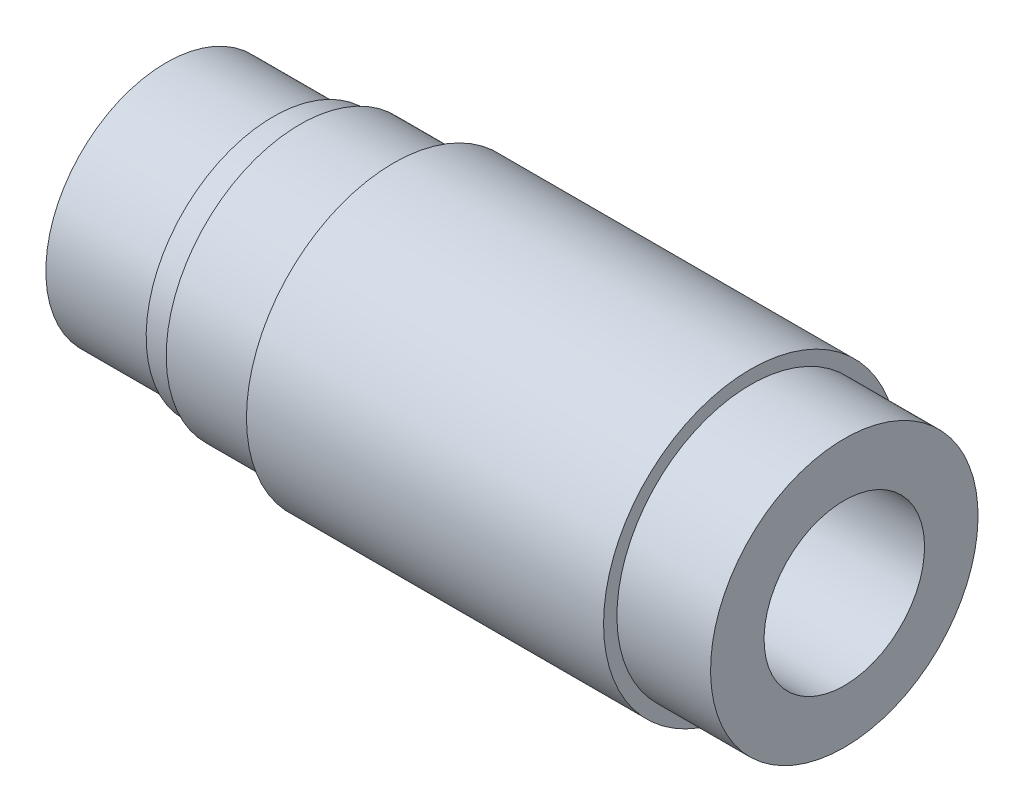
ISO-10303-21;
HEADER;
FILE_DESCRIPTION(('STEP AP214'),'2;1');
FILE_NAME('part.step','',(''),(''),'','','');
FILE_SCHEMA(('AUTOMOTIVE_DESIGN { 1 0 10303 214 1 1 1 1 }'));
ENDSEC;
DATA;
#1=APPLICATION_CONTEXT('core data for automotive mechanical design processes');
#2=APPLICATION_PROTOCOL_DEFINITION('international standard','automotive_design',2000,#1);
#3=PRODUCT_CONTEXT('',#1,'mechanical');
#4=PRODUCT('Part','Part','',(#3));
#5=PRODUCT_RELATED_PRODUCT_CATEGORY('part','',(#4));
#6=PRODUCT_DEFINITION_FORMATION('','',#4);
#7=PRODUCT_DEFINITION_CONTEXT('part definition',#1,'design');
#8=PRODUCT_DEFINITION('design','',#6,#7);
#9=PRODUCT_DEFINITION_SHAPE('','',#8);
#10=(LENGTH_UNIT() NAMED_UNIT(*) SI_UNIT(.MILLI.,.METRE.));
#11=(NAMED_UNIT(*) PLANE_ANGLE_UNIT() SI_UNIT($,.RADIAN.));
#12=(NAMED_UNIT(*) SI_UNIT($,.STERADIAN.) SOLID_ANGLE_UNIT());
#13=UNCERTAINTY_MEASURE_WITH_UNIT(LENGTH_MEASURE(1.E-05),#10,'distance_accuracy_value','');
#14=(GEOMETRIC_REPRESENTATION_CONTEXT(3) GLOBAL_UNCERTAINTY_ASSIGNED_CONTEXT((#13)) GLOBAL_UNIT_ASSIGNED_CONTEXT((#10,
#11,#12)) REPRESENTATION_CONTEXT('',''));
#15=CARTESIAN_POINT('',(0.,0.,0.));
#16=DIRECTION('',(0.,0.,1.));
#17=DIRECTION('',(1.,0.,0.));
#18=AXIS2_PLACEMENT_3D('',#15,#16,#17);
#19=CARTESIAN_POINT('',(8.,-1.11022302462498E-12,0.));
#20=DIRECTION('',(1.,0.,0.));
#21=DIRECTION('',(0.,1.,0.));
#22=AXIS2_PLACEMENT_3D('',#19,#20,#21);
#23=PLANE('',#22);
#24=CARTESIAN_POINT('',(7.99999999999997,0.,0.));
#25=DIRECTION('',(-1.,0.,0.));
#26=DIRECTION('',(0.,-1.,0.));
#27=AXIS2_PLACEMENT_3D('',#24,#25,#26);
#28=CIRCLE('',#27,9.);
#29=CARTESIAN_POINT('',(7.99999999999997,-8.99999999999999,0.));
#30=VERTEX_POINT('',#29);
#31=EDGE_CURVE('E10',#30,#30,#28,.T.);
#32=ORIENTED_EDGE('',*,*,#31,.F.);
#33=EDGE_LOOP('',(#32));
#34=FACE_BOUND('',#33,.T.);
#35=CARTESIAN_POINT('',(8.00000000000004,0.,0.));
#36=DIRECTION('',(-1.,0.,0.));
#37=DIRECTION('',(0.,-1.,0.));
#38=AXIS2_PLACEMENT_3D('',#35,#36,#37);
#39=CIRCLE('',#38,9.5);
#40=CARTESIAN_POINT('',(8.00000000000004,-9.49999999999999,0.));
#41=VERTEX_POINT('',#40);
#42=EDGE_CURVE('E81',#41,#41,#39,.T.);
#43=ORIENTED_EDGE('',*,*,#42,.T.);
#44=EDGE_LOOP('',(#43));
#45=FACE_BOUND('',#44,.T.);
#46=ADVANCED_FACE('F41',(#34,#45),#23,.F.);
#47=CARTESIAN_POINT('',(-4.0321987362546,0.,0.));
#48=DIRECTION('',(-1.,0.,0.));
#49=DIRECTION('',(0.,-1.,0.));
#50=AXIS2_PLACEMENT_3D('',#47,#48,#49);
#51=CYLINDRICAL_SURFACE('',#50,8.99999999999999);
#52=CARTESIAN_POINT('',(0.,0.,0.));
#53=DIRECTION('',(-1.,0.,0.));
#54=DIRECTION('',(0.,-1.,0.));
#55=AXIS2_PLACEMENT_3D('',#52,#53,#54);
#56=CIRCLE('',#55,8.99999999999999);
#57=CARTESIAN_POINT('',(0.,-8.99999999999999,0.));
#58=VERTEX_POINT('',#57);
#59=EDGE_CURVE('E47',#58,#58,#56,.T.);
#60=ORIENTED_EDGE('',*,*,#59,.F.);
#61=EDGE_LOOP('',(#60));
#62=FACE_BOUND('',#61,.T.);
#63=ORIENTED_EDGE('',*,*,#31,.T.);
#64=EDGE_LOOP('',(#63));
#65=FACE_BOUND('',#64,.T.);
#66=ADVANCED_FACE('F142',(#62,#65),#51,.T.);
#67=CARTESIAN_POINT('',(0.,0.,0.));
#68=DIRECTION('',(1.,0.,0.));
#69=DIRECTION('',(0.,1.,0.));
#70=AXIS2_PLACEMENT_3D('',#67,#68,#69);
#71=PLANE('',#70);
#72=CARTESIAN_POINT('',(0.,0.,0.));
#73=DIRECTION('',(-1.,0.,0.));
#74=DIRECTION('',(0.,-1.,0.));
#75=AXIS2_PLACEMENT_3D('',#72,#73,#74);
#76=CIRCLE('',#75,5.99999999999999);
#77=CARTESIAN_POINT('',(0.,-5.99999999999999,0.));
#78=VERTEX_POINT('',#77);
#79=EDGE_CURVE('E51',#78,#78,#76,.T.);
#80=ORIENTED_EDGE('',*,*,#79,.F.);
#81=EDGE_LOOP('',(#80));
#82=FACE_BOUND('',#81,.T.);
#83=ORIENTED_EDGE('',*,*,#59,.T.);
#84=EDGE_LOOP('',(#83));
#85=FACE_BOUND('',#84,.T.);
#86=ADVANCED_FACE('F137',(#82,#85),#71,.F.);
#87=CARTESIAN_POINT('',(-4.0321987362546,0.,0.));
#88=DIRECTION('',(-1.,0.,0.));
#89=DIRECTION('',(0.,-1.,0.));
#90=AXIS2_PLACEMENT_3D('',#87,#88,#89);
#91=CYLINDRICAL_SURFACE('',#90,5.99999999999999);
#92=CARTESIAN_POINT('',(50.7000000000001,0.,0.));
#93=DIRECTION('',(-1.,0.,0.));
#94=DIRECTION('',(0.,-1.,0.));
#95=AXIS2_PLACEMENT_3D('',#92,#93,#94);
#96=CIRCLE('',#95,5.99999999999999);
#97=CARTESIAN_POINT('',(50.7000000000001,-5.99999999999998,0.));
#98=VERTEX_POINT('',#97);
#99=EDGE_CURVE('E55',#98,#98,#96,.T.);
#100=ORIENTED_EDGE('',*,*,#99,.F.);
#101=EDGE_LOOP('',(#100));
#102=FACE_BOUND('',#101,.T.);
#103=ORIENTED_EDGE('',*,*,#79,.T.);
#104=EDGE_LOOP('',(#103));
#105=FACE_BOUND('',#104,.T.);
#106=ADVANCED_FACE('F131',(#102,#105),#91,.F.);
#107=CARTESIAN_POINT('',(50.7000000000001,3.51801920928098E-13,0.));
#108=DIRECTION('',(-1.,0.,0.));
#109=DIRECTION('',(0.,-1.,0.));
#110=AXIS2_PLACEMENT_3D('',#107,#108,#109);
#111=PLANE('',#110);
#112=CARTESIAN_POINT('',(50.7000000000001,0.,0.));
#113=DIRECTION('',(-1.,0.,0.));
#114=DIRECTION('',(0.,-1.,0.));
#115=AXIS2_PLACEMENT_3D('',#112,#113,#114);
#116=CIRCLE('',#115,9.99999999999998);
#117=CARTESIAN_POINT('',(50.7000000000001,-9.99999999999997,0.));
#118=VERTEX_POINT('',#117);
#119=EDGE_CURVE('E60',#118,#118,#116,.T.);
#120=ORIENTED_EDGE('',*,*,#119,.F.);
#121=EDGE_LOOP('',(#120));
#122=FACE_BOUND('',#121,.T.);
#123=ORIENTED_EDGE('',*,*,#99,.T.);
#124=EDGE_LOOP('',(#123));
#125=FACE_BOUND('',#124,.T.);
#126=ADVANCED_FACE('F125',(#122,#125),#111,.F.);
#127=CARTESIAN_POINT('',(-4.0321987362546,0.,0.));
#128=DIRECTION('',(-1.,0.,0.));
#129=DIRECTION('',(0.,-1.,0.));
#130=AXIS2_PLACEMENT_3D('',#127,#128,#129);
#131=CYLINDRICAL_SURFACE('',#130,9.99999999999998);
#132=CARTESIAN_POINT('',(43.7,0.,0.));
#133=DIRECTION('',(-1.,0.,0.));
#134=DIRECTION('',(0.,-1.,0.));
#135=AXIS2_PLACEMENT_3D('',#132,#133,#134);
#136=CIRCLE('',#135,9.99999999999999);
#137=CARTESIAN_POINT('',(43.7,-9.99999999999998,0.));
#138=VERTEX_POINT('',#137);
#139=EDGE_CURVE('E63',#138,#138,#136,.T.);
#140=ORIENTED_EDGE('',*,*,#139,.F.);
#141=EDGE_LOOP('',(#140));
#142=FACE_BOUND('',#141,.T.);
#143=ORIENTED_EDGE('',*,*,#119,.T.);
#144=EDGE_LOOP('',(#143));
#145=FACE_BOUND('',#144,.T.);
#146=ADVANCED_FACE('F119',(#142,#145),#131,.T.);
#147=CARTESIAN_POINT('',(43.7,0.,0.));
#148=DIRECTION('',(-1.,0.,0.));
#149=DIRECTION('',(0.,-1.,0.));
#150=AXIS2_PLACEMENT_3D('',#147,#148,#149);
#151=PLANE('',#150);
#152=CARTESIAN_POINT('',(43.7,0.,0.));
#153=DIRECTION('',(-1.,0.,0.));
#154=DIRECTION('',(0.,-1.,0.));
#155=AXIS2_PLACEMENT_3D('',#152,#153,#154);
#156=CIRCLE('',#155,11.);
#157=CARTESIAN_POINT('',(43.7,-11.,0.));
#158=VERTEX_POINT('',#157);
#159=EDGE_CURVE('E66',#158,#158,#156,.T.);
#160=ORIENTED_EDGE('',*,*,#159,.F.);
#161=EDGE_LOOP('',(#160));
#162=FACE_BOUND('',#161,.T.);
#163=ORIENTED_EDGE('',*,*,#139,.T.);
#164=EDGE_LOOP('',(#163));
#165=FACE_BOUND('',#164,.T.);
#166=ADVANCED_FACE('F113',(#162,#165),#151,.F.);
#167=CARTESIAN_POINT('',(-4.0321987362546,0.,0.));
#168=DIRECTION('',(-1.,0.,0.));
#169=DIRECTION('',(0.,-1.,0.));
#170=AXIS2_PLACEMENT_3D('',#167,#168,#169);
#171=CYLINDRICAL_SURFACE('',#170,11.);
#172=CARTESIAN_POINT('',(17.,0.,0.));
#173=DIRECTION('',(-1.,0.,0.));
#174=DIRECTION('',(0.,-1.,0.));
#175=AXIS2_PLACEMENT_3D('',#172,#173,#174);
#176=CIRCLE('',#175,11.);
#177=CARTESIAN_POINT('',(17.,-11.,0.));
#178=VERTEX_POINT('',#177);
#179=EDGE_CURVE('E69',#178,#178,#176,.T.);
#180=ORIENTED_EDGE('',*,*,#179,.F.);
#181=EDGE_LOOP('',(#180));
#182=FACE_BOUND('',#181,.T.);
#183=ORIENTED_EDGE('',*,*,#159,.T.);
#184=EDGE_LOOP('',(#183));
#185=FACE_BOUND('',#184,.T.);
#186=ADVANCED_FACE('F107',(#182,#185),#171,.T.);
#187=CARTESIAN_POINT('',(17.,0.,0.));
#188=DIRECTION('',(1.,0.,0.));
#189=DIRECTION('',(0.,1.,0.));
#190=AXIS2_PLACEMENT_3D('',#187,#188,#189);
#191=PLANE('',#190);
#192=CARTESIAN_POINT('',(17.,0.,0.));
#193=DIRECTION('',(-1.,0.,0.));
#194=DIRECTION('',(0.,-1.,0.));
#195=AXIS2_PLACEMENT_3D('',#192,#193,#194);
#196=CIRCLE('',#195,10.);
#197=CARTESIAN_POINT('',(17.,-9.99999999999999,0.));
#198=VERTEX_POINT('',#197);
#199=EDGE_CURVE('E72',#198,#198,#196,.T.);
#200=ORIENTED_EDGE('',*,*,#199,.F.);
#201=EDGE_LOOP('',(#200));
#202=FACE_BOUND('',#201,.T.);
#203=ORIENTED_EDGE('',*,*,#179,.T.);
#204=EDGE_LOOP('',(#203));
#205=FACE_BOUND('',#204,.T.);
#206=ADVANCED_FACE('F101',(#202,#205),#191,.F.);
#207=CARTESIAN_POINT('',(-4.0321987362546,0.,0.));
#208=DIRECTION('',(-1.,0.,0.));
#209=DIRECTION('',(0.,-1.,0.));
#210=AXIS2_PLACEMENT_3D('',#207,#208,#209);
#211=CYLINDRICAL_SURFACE('',#210,10.);
#212=CARTESIAN_POINT('',(10.,0.,0.));
#213=DIRECTION('',(-1.,0.,0.));
#214=DIRECTION('',(0.,-1.,0.));
#215=AXIS2_PLACEMENT_3D('',#212,#213,#214);
#216=CIRCLE('',#215,10.);
#217=CARTESIAN_POINT('',(10.,-10.,0.));
#218=VERTEX_POINT('',#217);
#219=EDGE_CURVE('E75',#218,#218,#216,.T.);
#220=ORIENTED_EDGE('',*,*,#219,.F.);
#221=EDGE_LOOP('',(#220));
#222=FACE_BOUND('',#221,.T.);
#223=ORIENTED_EDGE('',*,*,#199,.T.);
#224=EDGE_LOOP('',(#223));
#225=FACE_BOUND('',#224,.T.);
#226=ADVANCED_FACE('F95',(#222,#225),#211,.T.);
#227=CARTESIAN_POINT('',(10.,0.,0.));
#228=DIRECTION('',(1.,0.,0.));
#229=DIRECTION('',(0.,1.,0.));
#230=AXIS2_PLACEMENT_3D('',#227,#228,#229);
#231=PLANE('',#230);
#232=CARTESIAN_POINT('',(10.,0.,0.));
#233=DIRECTION('',(-1.,0.,0.));
#234=DIRECTION('',(0.,-1.,0.));
#235=AXIS2_PLACEMENT_3D('',#232,#233,#234);
#236=CIRCLE('',#235,9.5);
#237=CARTESIAN_POINT('',(10.,-9.5,0.));
#238=VERTEX_POINT('',#237);
#239=EDGE_CURVE('E78',#238,#238,#236,.T.);
#240=ORIENTED_EDGE('',*,*,#239,.F.);
#241=EDGE_LOOP('',(#240));
#242=FACE_BOUND('',#241,.T.);
#243=ORIENTED_EDGE('',*,*,#219,.T.);
#244=EDGE_LOOP('',(#243));
#245=FACE_BOUND('',#244,.T.);
#246=ADVANCED_FACE('F89',(#242,#245),#231,.F.);
#247=CARTESIAN_POINT('',(-4.0321987362546,0.,0.));
#248=DIRECTION('',(-1.,0.,0.));
#249=DIRECTION('',(0.,-1.,0.));
#250=AXIS2_PLACEMENT_3D('',#247,#248,#249);
#251=CYLINDRICAL_SURFACE('',#250,9.5);
#252=ORIENTED_EDGE('',*,*,#42,.F.);
#253=EDGE_LOOP('',(#252));
#254=FACE_BOUND('',#253,.T.);
#255=ORIENTED_EDGE('',*,*,#239,.T.);
#256=EDGE_LOOP('',(#255));
#257=FACE_BOUND('',#256,.T.);
#258=ADVANCED_FACE('F86',(#254,#257),#251,.T.);
#259=CLOSED_SHELL('',(#46,#66,#86,#106,#126,#146,#166,#186,#206,#226,#246,#258));
#260=MANIFOLD_SOLID_BREP('B2',#259);
#261=ADVANCED_BREP_SHAPE_REPRESENTATION('',(#18,#260),#14);
#262=SHAPE_DEFINITION_REPRESENTATION(#9,#261);
ENDSEC;
END-ISO-10303-21;
